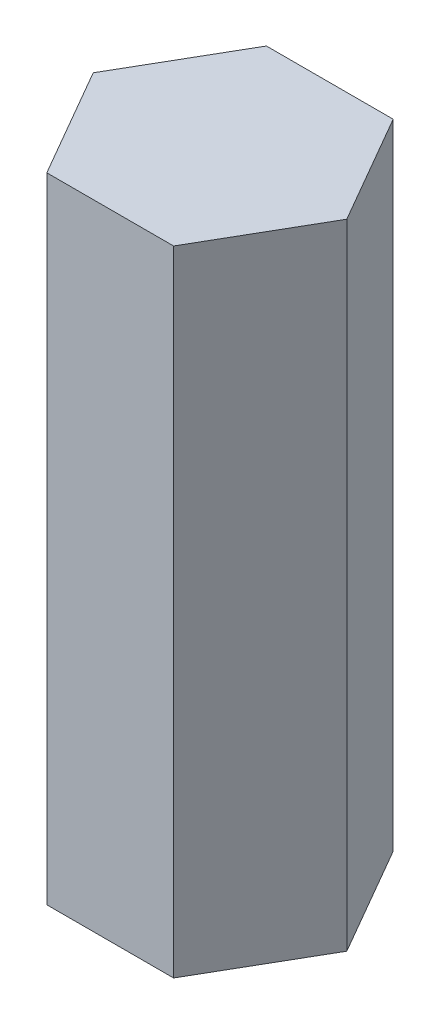
ISO-10303-21;
HEADER;
FILE_DESCRIPTION(('STEP AP214'),'2;1');
FILE_NAME('part.step','',(''),(''),'','','');
FILE_SCHEMA(('AUTOMOTIVE_DESIGN { 1 0 10303 214 1 1 1 1 }'));
ENDSEC;
DATA;
#1=APPLICATION_CONTEXT('core data for automotive mechanical design processes');
#2=APPLICATION_PROTOCOL_DEFINITION('international standard','automotive_design',2000,#1);
#3=PRODUCT_CONTEXT('',#1,'mechanical');
#4=PRODUCT('Part','Part','',(#3));
#5=PRODUCT_RELATED_PRODUCT_CATEGORY('part','',(#4));
#6=PRODUCT_DEFINITION_FORMATION('','',#4);
#7=PRODUCT_DEFINITION_CONTEXT('part definition',#1,'design');
#8=PRODUCT_DEFINITION('design','',#6,#7);
#9=PRODUCT_DEFINITION_SHAPE('','',#8);
#10=(LENGTH_UNIT() NAMED_UNIT(*) SI_UNIT(.MILLI.,.METRE.));
#11=(NAMED_UNIT(*) PLANE_ANGLE_UNIT() SI_UNIT($,.RADIAN.));
#12=(NAMED_UNIT(*) SI_UNIT($,.STERADIAN.) SOLID_ANGLE_UNIT());
#13=UNCERTAINTY_MEASURE_WITH_UNIT(LENGTH_MEASURE(1.E-05),#10,'distance_accuracy_value','');
#14=(GEOMETRIC_REPRESENTATION_CONTEXT(3) GLOBAL_UNCERTAINTY_ASSIGNED_CONTEXT((#13)) GLOBAL_UNIT_ASSIGNED_CONTEXT((#10,
#11,#12)) REPRESENTATION_CONTEXT('',''));
#15=CARTESIAN_POINT('',(0.,0.,0.));
#16=DIRECTION('',(0.,0.,1.));
#17=DIRECTION('',(1.,0.,0.));
#18=AXIS2_PLACEMENT_3D('',#15,#16,#17);
#19=CARTESIAN_POINT('',(7.5,75.,12.9903810567666));
#20=DIRECTION('',(-0.866025403784439,0.,-0.5));
#21=DIRECTION('',(-0.5,0.,0.866025403784439));
#22=AXIS2_PLACEMENT_3D('',#19,#20,#21);
#23=PLANE('',#22);
#24=DIRECTION('',(0.5,0.,-0.866025403784439));
#25=VECTOR('',#24,1.);
#26=CARTESIAN_POINT('',(7.5,0.,12.9903810567666));
#27=LINE('',#26,#25);
#28=CARTESIAN_POINT('',(7.5,0.,12.9903810567666));
#29=VERTEX_POINT('',#28);
#30=CARTESIAN_POINT('',(15.,0.,0.));
#31=VERTEX_POINT('',#30);
#32=EDGE_CURVE('E119',#29,#31,#27,.T.);
#33=ORIENTED_EDGE('',*,*,#32,.T.);
#34=DIRECTION('',(0.,-1.,0.));
#35=VECTOR('',#34,1.);
#36=CARTESIAN_POINT('',(15.,75.,0.));
#37=LINE('',#36,#35);
#38=CARTESIAN_POINT('',(15.,75.,0.));
#39=VERTEX_POINT('',#38);
#40=EDGE_CURVE('E11',#39,#31,#37,.T.);
#41=ORIENTED_EDGE('',*,*,#40,.F.);
#42=DIRECTION('',(0.5,0.,-0.866025403784439));
#43=VECTOR('',#42,1.);
#44=CARTESIAN_POINT('',(7.5,75.,12.9903810567666));
#45=LINE('',#44,#43);
#46=CARTESIAN_POINT('',(7.5,75.,12.9903810567666));
#47=VERTEX_POINT('',#46);
#48=EDGE_CURVE('E129',#47,#39,#45,.T.);
#49=ORIENTED_EDGE('',*,*,#48,.F.);
#50=DIRECTION('',(0.,-1.,0.));
#51=VECTOR('',#50,1.);
#52=CARTESIAN_POINT('',(7.5,75.,12.9903810567666));
#53=LINE('',#52,#51);
#54=EDGE_CURVE('E115',#47,#29,#53,.T.);
#55=ORIENTED_EDGE('',*,*,#54,.T.);
#56=EDGE_LOOP('',(#33,#41,#49,#55));
#57=FACE_BOUND('',#56,.T.);
#58=ADVANCED_FACE('F35',(#57),#23,.F.);
#59=CARTESIAN_POINT('',(15.,75.,0.));
#60=DIRECTION('',(-0.866025403784439,0.,0.5));
#61=DIRECTION('',(0.5,0.,0.866025403784439));
#62=AXIS2_PLACEMENT_3D('',#59,#60,#61);
#63=PLANE('',#62);
#64=DIRECTION('',(-0.5,0.,-0.866025403784439));
#65=VECTOR('',#64,1.);
#66=CARTESIAN_POINT('',(15.,0.,0.));
#67=LINE('',#66,#65);
#68=CARTESIAN_POINT('',(7.5,0.,-12.9903810567666));
#69=VERTEX_POINT('',#68);
#70=EDGE_CURVE('E122',#31,#69,#67,.T.);
#71=ORIENTED_EDGE('',*,*,#70,.T.);
#72=DIRECTION('',(0.,-1.,0.));
#73=VECTOR('',#72,1.);
#74=CARTESIAN_POINT('',(7.5,75.,-12.9903810567666));
#75=LINE('',#74,#73);
#76=CARTESIAN_POINT('',(7.5,75.,-12.9903810567666));
#77=VERTEX_POINT('',#76);
#78=EDGE_CURVE('E43',#77,#69,#75,.T.);
#79=ORIENTED_EDGE('',*,*,#78,.F.);
#80=DIRECTION('',(-0.5,0.,-0.866025403784439));
#81=VECTOR('',#80,1.);
#82=CARTESIAN_POINT('',(15.,75.,0.));
#83=LINE('',#82,#81);
#84=EDGE_CURVE('E88',#39,#77,#83,.T.);
#85=ORIENTED_EDGE('',*,*,#84,.F.);
#86=ORIENTED_EDGE('',*,*,#40,.T.);
#87=EDGE_LOOP('',(#71,#79,#85,#86));
#88=FACE_BOUND('',#87,.T.);
#89=ADVANCED_FACE('F153',(#88),#63,.F.);
#90=CARTESIAN_POINT('',(7.5,75.,-12.9903810567666));
#91=DIRECTION('',(0.,0.,1.));
#92=DIRECTION('',(1.,0.,0.));
#93=AXIS2_PLACEMENT_3D('',#90,#91,#92);
#94=PLANE('',#93);
#95=DIRECTION('',(-1.,0.,0.));
#96=VECTOR('',#95,1.);
#97=CARTESIAN_POINT('',(7.5,0.,-12.9903810567666));
#98=LINE('',#97,#96);
#99=CARTESIAN_POINT('',(-7.5,0.,-12.9903810567666));
#100=VERTEX_POINT('',#99);
#101=EDGE_CURVE('E124',#69,#100,#98,.T.);
#102=ORIENTED_EDGE('',*,*,#101,.T.);
#103=DIRECTION('',(0.,-1.,0.));
#104=VECTOR('',#103,1.);
#105=CARTESIAN_POINT('',(-7.5,75.,-12.9903810567666));
#106=LINE('',#105,#104);
#107=CARTESIAN_POINT('',(-7.5,75.,-12.9903810567666));
#108=VERTEX_POINT('',#107);
#109=EDGE_CURVE('E110',#108,#100,#106,.T.);
#110=ORIENTED_EDGE('',*,*,#109,.F.);
#111=DIRECTION('',(-1.,0.,0.));
#112=VECTOR('',#111,1.);
#113=CARTESIAN_POINT('',(7.5,75.,-12.9903810567666));
#114=LINE('',#113,#112);
#115=EDGE_CURVE('E101',#77,#108,#114,.T.);
#116=ORIENTED_EDGE('',*,*,#115,.F.);
#117=ORIENTED_EDGE('',*,*,#78,.T.);
#118=EDGE_LOOP('',(#102,#110,#116,#117));
#119=FACE_BOUND('',#118,.T.);
#120=ADVANCED_FACE('F135',(#119),#94,.F.);
#121=CARTESIAN_POINT('',(-7.5,75.,-12.9903810567666));
#122=DIRECTION('',(0.866025403784439,0.,0.5));
#123=DIRECTION('',(0.5,0.,-0.866025403784439));
#124=AXIS2_PLACEMENT_3D('',#121,#122,#123);
#125=PLANE('',#124);
#126=DIRECTION('',(-0.5,0.,0.866025403784439));
#127=VECTOR('',#126,1.);
#128=CARTESIAN_POINT('',(-7.5,0.,-12.9903810567666));
#129=LINE('',#128,#127);
#130=CARTESIAN_POINT('',(-15.,0.,0.));
#131=VERTEX_POINT('',#130);
#132=EDGE_CURVE('E109',#100,#131,#129,.T.);
#133=ORIENTED_EDGE('',*,*,#132,.T.);
#134=DIRECTION('',(0.,-1.,0.));
#135=VECTOR('',#134,1.);
#136=CARTESIAN_POINT('',(-15.,75.,0.));
#137=LINE('',#136,#135);
#138=CARTESIAN_POINT('',(-15.,75.,0.));
#139=VERTEX_POINT('',#138);
#140=EDGE_CURVE('E106',#139,#131,#137,.T.);
#141=ORIENTED_EDGE('',*,*,#140,.F.);
#142=DIRECTION('',(-0.5,0.,0.866025403784439));
#143=VECTOR('',#142,1.);
#144=CARTESIAN_POINT('',(-7.5,75.,-12.9903810567666));
#145=LINE('',#144,#143);
#146=EDGE_CURVE('E95',#108,#139,#145,.T.);
#147=ORIENTED_EDGE('',*,*,#146,.F.);
#148=ORIENTED_EDGE('',*,*,#109,.T.);
#149=EDGE_LOOP('',(#133,#141,#147,#148));
#150=FACE_BOUND('',#149,.T.);
#151=ADVANCED_FACE('F107',(#150),#125,.F.);
#152=CARTESIAN_POINT('',(-15.,75.,0.));
#153=DIRECTION('',(0.866025403784438,0.,-0.5));
#154=DIRECTION('',(-0.5,0.,-0.866025403784439));
#155=AXIS2_PLACEMENT_3D('',#152,#153,#154);
#156=PLANE('',#155);
#157=DIRECTION('',(0.5,0.,0.866025403784438));
#158=VECTOR('',#157,1.);
#159=CARTESIAN_POINT('',(-15.,0.,0.));
#160=LINE('',#159,#158);
#161=CARTESIAN_POINT('',(-7.5,0.,12.9903810567666));
#162=VERTEX_POINT('',#161);
#163=EDGE_CURVE('E74',#131,#162,#160,.T.);
#164=ORIENTED_EDGE('',*,*,#163,.T.);
#165=DIRECTION('',(0.,-1.,0.));
#166=VECTOR('',#165,1.);
#167=CARTESIAN_POINT('',(-7.5,75.,12.9903810567666));
#168=LINE('',#167,#166);
#169=CARTESIAN_POINT('',(-7.5,75.,12.9903810567666));
#170=VERTEX_POINT('',#169);
#171=EDGE_CURVE('E111',#170,#162,#168,.T.);
#172=ORIENTED_EDGE('',*,*,#171,.F.);
#173=DIRECTION('',(0.5,0.,0.866025403784438));
#174=VECTOR('',#173,1.);
#175=CARTESIAN_POINT('',(-15.,75.,0.));
#176=LINE('',#175,#174);
#177=EDGE_CURVE('E99',#139,#170,#176,.T.);
#178=ORIENTED_EDGE('',*,*,#177,.F.);
#179=ORIENTED_EDGE('',*,*,#140,.T.);
#180=EDGE_LOOP('',(#164,#172,#178,#179));
#181=FACE_BOUND('',#180,.T.);
#182=ADVANCED_FACE('F113',(#181),#156,.F.);
#183=CARTESIAN_POINT('',(-7.5,75.,12.9903810567666));
#184=DIRECTION('',(0.,0.,-1.));
#185=DIRECTION('',(-1.,0.,0.));
#186=AXIS2_PLACEMENT_3D('',#183,#184,#185);
#187=PLANE('',#186);
#188=DIRECTION('',(1.,0.,0.));
#189=VECTOR('',#188,1.);
#190=CARTESIAN_POINT('',(-7.5,0.,12.9903810567666));
#191=LINE('',#190,#189);
#192=EDGE_CURVE('E80',#162,#29,#191,.T.);
#193=ORIENTED_EDGE('',*,*,#192,.T.);
#194=ORIENTED_EDGE('',*,*,#54,.F.);
#195=DIRECTION('',(1.,0.,0.));
#196=VECTOR('',#195,1.);
#197=CARTESIAN_POINT('',(-7.5,75.,12.9903810567666));
#198=LINE('',#197,#196);
#199=EDGE_CURVE('E51',#170,#47,#198,.T.);
#200=ORIENTED_EDGE('',*,*,#199,.F.);
#201=ORIENTED_EDGE('',*,*,#171,.T.);
#202=EDGE_LOOP('',(#193,#194,#200,#201));
#203=FACE_BOUND('',#202,.T.);
#204=ADVANCED_FACE('F142',(#203),#187,.F.);
#205=CARTESIAN_POINT('',(0.,75.,0.));
#206=DIRECTION('',(0.,1.,0.));
#207=DIRECTION('',(0.,0.,1.));
#208=AXIS2_PLACEMENT_3D('',#205,#206,#207);
#209=PLANE('',#208);
#210=ORIENTED_EDGE('',*,*,#48,.T.);
#211=ORIENTED_EDGE('',*,*,#84,.T.);
#212=ORIENTED_EDGE('',*,*,#115,.T.);
#213=ORIENTED_EDGE('',*,*,#146,.T.);
#214=ORIENTED_EDGE('',*,*,#177,.T.);
#215=ORIENTED_EDGE('',*,*,#199,.T.);
#216=EDGE_LOOP('',(#210,#211,#212,#213,#214,#215));
#217=FACE_BOUND('',#216,.T.);
#218=ADVANCED_FACE('F97',(#217),#209,.T.);
#219=CARTESIAN_POINT('',(0.,0.,0.));
#220=DIRECTION('',(0.,1.,0.));
#221=DIRECTION('',(0.,0.,1.));
#222=AXIS2_PLACEMENT_3D('',#219,#220,#221);
#223=PLANE('',#222);
#224=ORIENTED_EDGE('',*,*,#32,.F.);
#225=ORIENTED_EDGE('',*,*,#192,.F.);
#226=ORIENTED_EDGE('',*,*,#163,.F.);
#227=ORIENTED_EDGE('',*,*,#132,.F.);
#228=ORIENTED_EDGE('',*,*,#101,.F.);
#229=ORIENTED_EDGE('',*,*,#70,.F.);
#230=EDGE_LOOP('',(#224,#225,#226,#227,#228,#229));
#231=FACE_BOUND('',#230,.T.);
#232=ADVANCED_FACE('F138',(#231),#223,.F.);
#233=CLOSED_SHELL('',(#58,#89,#120,#151,#182,#204,#218,#232));
#234=MANIFOLD_SOLID_BREP('B2',#233);
#235=ADVANCED_BREP_SHAPE_REPRESENTATION('',(#18,#234),#14);
#236=SHAPE_DEFINITION_REPRESENTATION(#9,#235);
ENDSEC;
END-ISO-10303-21;
